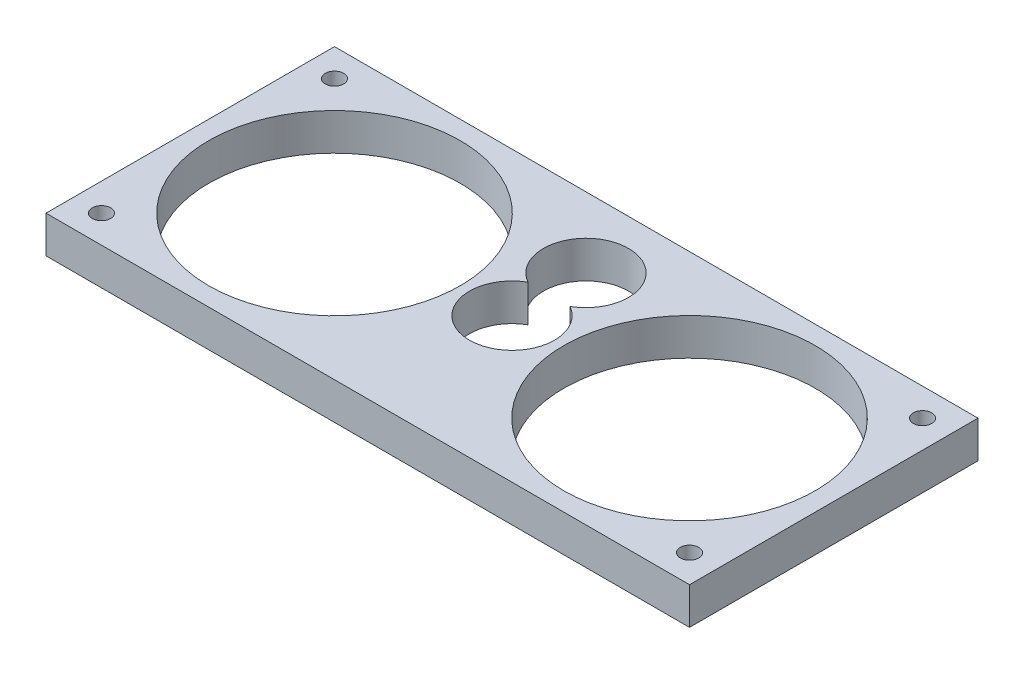
ISO-10303-21;
HEADER;
FILE_DESCRIPTION(('STEP AP214'),'2;1');
FILE_NAME('part.step','',(''),(''),'','','');
FILE_SCHEMA(('AUTOMOTIVE_DESIGN { 1 0 10303 214 1 1 1 1 }'));
ENDSEC;
DATA;
#1=APPLICATION_CONTEXT('core data for automotive mechanical design processes');
#2=APPLICATION_PROTOCOL_DEFINITION('international standard','automotive_design',2000,#1);
#3=PRODUCT_CONTEXT('',#1,'mechanical');
#4=PRODUCT('Part','Part','',(#3));
#5=PRODUCT_RELATED_PRODUCT_CATEGORY('part','',(#4));
#6=PRODUCT_DEFINITION_FORMATION('','',#4);
#7=PRODUCT_DEFINITION_CONTEXT('part definition',#1,'design');
#8=PRODUCT_DEFINITION('design','',#6,#7);
#9=PRODUCT_DEFINITION_SHAPE('','',#8);
#10=(LENGTH_UNIT() NAMED_UNIT(*) SI_UNIT(.MILLI.,.METRE.));
#11=(NAMED_UNIT(*) PLANE_ANGLE_UNIT() SI_UNIT($,.RADIAN.));
#12=(NAMED_UNIT(*) SI_UNIT($,.STERADIAN.) SOLID_ANGLE_UNIT());
#13=UNCERTAINTY_MEASURE_WITH_UNIT(LENGTH_MEASURE(1.E-05),#10,'distance_accuracy_value','');
#14=(GEOMETRIC_REPRESENTATION_CONTEXT(3) GLOBAL_UNCERTAINTY_ASSIGNED_CONTEXT((#13)) GLOBAL_UNIT_ASSIGNED_CONTEXT((#10,
#11,#12)) REPRESENTATION_CONTEXT('',''));
#15=CARTESIAN_POINT('',(0.,0.,0.));
#16=DIRECTION('',(0.,0.,1.));
#17=DIRECTION('',(1.,0.,0.));
#18=AXIS2_PLACEMENT_3D('',#15,#16,#17);
#19=CARTESIAN_POINT('',(0.,10.,0.));
#20=DIRECTION('',(0.,-1.,0.));
#21=DIRECTION('',(0.,0.,-1.));
#22=AXIS2_PLACEMENT_3D('',#19,#20,#21);
#23=PLANE('',#22);
#24=CARTESIAN_POINT('',(79.5,10.,-31.5));
#25=DIRECTION('',(0.,1.,0.));
#26=DIRECTION('',(0.,0.,1.));
#27=AXIS2_PLACEMENT_3D('',#24,#25,#26);
#28=CIRCLE('',#27,2.5);
#29=CARTESIAN_POINT('',(79.5,10.,-29.));
#30=VERTEX_POINT('',#29);
#31=EDGE_CURVE('E102',#30,#30,#28,.T.);
#32=ORIENTED_EDGE('',*,*,#31,.F.);
#33=EDGE_LOOP('',(#32));
#34=FACE_BOUND('',#33,.T.);
#35=CARTESIAN_POINT('',(79.5,10.,31.5));
#36=DIRECTION('',(0.,1.,0.));
#37=DIRECTION('',(0.,0.,1.));
#38=AXIS2_PLACEMENT_3D('',#35,#36,#37);
#39=CIRCLE('',#38,2.5);
#40=CARTESIAN_POINT('',(79.5,10.,34.));
#41=VERTEX_POINT('',#40);
#42=EDGE_CURVE('E108',#41,#41,#39,.T.);
#43=ORIENTED_EDGE('',*,*,#42,.F.);
#44=EDGE_LOOP('',(#43));
#45=FACE_BOUND('',#44,.T.);
#46=CARTESIAN_POINT('',(-79.5,10.,31.5));
#47=DIRECTION('',(0.,1.,0.));
#48=DIRECTION('',(0.,0.,1.));
#49=AXIS2_PLACEMENT_3D('',#46,#47,#48);
#50=CIRCLE('',#49,2.5);
#51=CARTESIAN_POINT('',(-79.5,10.,34.));
#52=VERTEX_POINT('',#51);
#53=EDGE_CURVE('E114',#52,#52,#50,.T.);
#54=ORIENTED_EDGE('',*,*,#53,.F.);
#55=EDGE_LOOP('',(#54));
#56=FACE_BOUND('',#55,.T.);
#57=CARTESIAN_POINT('',(-79.5,10.,-31.5));
#58=DIRECTION('',(0.,1.,0.));
#59=DIRECTION('',(0.,0.,1.));
#60=AXIS2_PLACEMENT_3D('',#57,#58,#59);
#61=CIRCLE('',#60,2.5);
#62=CARTESIAN_POINT('',(-79.5,10.,-29.));
#63=VERTEX_POINT('',#62);
#64=EDGE_CURVE('E120',#63,#63,#61,.T.);
#65=ORIENTED_EDGE('',*,*,#64,.F.);
#66=EDGE_LOOP('',(#65));
#67=FACE_BOUND('',#66,.T.);
#68=CARTESIAN_POINT('',(48.,10.,0.));
#69=DIRECTION('',(0.,1.,0.));
#70=DIRECTION('',(0.,0.,1.));
#71=AXIS2_PLACEMENT_3D('',#68,#69,#70);
#72=CIRCLE('',#71,34.);
#73=CARTESIAN_POINT('',(48.,10.,34.));
#74=VERTEX_POINT('',#73);
#75=EDGE_CURVE('E126',#74,#74,#72,.T.);
#76=ORIENTED_EDGE('',*,*,#75,.F.);
#77=EDGE_LOOP('',(#76));
#78=FACE_BOUND('',#77,.T.);
#79=CARTESIAN_POINT('',(-48.,10.,0.));
#80=DIRECTION('',(0.,1.,0.));
#81=DIRECTION('',(0.,0.,1.));
#82=AXIS2_PLACEMENT_3D('',#79,#80,#81);
#83=CIRCLE('',#82,34.);
#84=CARTESIAN_POINT('',(-48.,10.,34.));
#85=VERTEX_POINT('',#84);
#86=EDGE_CURVE('E132',#85,#85,#83,.T.);
#87=ORIENTED_EDGE('',*,*,#86,.F.);
#88=EDGE_LOOP('',(#87));
#89=FACE_BOUND('',#88,.T.);
#90=DIRECTION('',(0.,0.,1.));
#91=VECTOR('',#90,1.);
#92=CARTESIAN_POINT('',(-87.,10.,39.));
#93=LINE('',#92,#91);
#94=CARTESIAN_POINT('',(-87.,10.,-39.));
#95=VERTEX_POINT('',#94);
#96=CARTESIAN_POINT('',(-87.,10.,39.));
#97=VERTEX_POINT('',#96);
#98=EDGE_CURVE('E138',#95,#97,#93,.T.);
#99=ORIENTED_EDGE('',*,*,#98,.T.);
#100=DIRECTION('',(1.,0.,0.));
#101=VECTOR('',#100,1.);
#102=CARTESIAN_POINT('',(-87.,10.,39.));
#103=LINE('',#102,#101);
#104=CARTESIAN_POINT('',(87.,10.,39.));
#105=VERTEX_POINT('',#104);
#106=EDGE_CURVE('E141',#97,#105,#103,.T.);
#107=ORIENTED_EDGE('',*,*,#106,.T.);
#108=DIRECTION('',(0.,0.,-1.));
#109=VECTOR('',#108,1.);
#110=CARTESIAN_POINT('',(87.,10.,39.));
#111=LINE('',#110,#109);
#112=CARTESIAN_POINT('',(87.,10.,-39.));
#113=VERTEX_POINT('',#112);
#114=EDGE_CURVE('E144',#105,#113,#111,.T.);
#115=ORIENTED_EDGE('',*,*,#114,.T.);
#116=DIRECTION('',(-1.,0.,0.));
#117=VECTOR('',#116,1.);
#118=CARTESIAN_POINT('',(-87.,10.,-39.));
#119=LINE('',#118,#117);
#120=EDGE_CURVE('E146',#113,#95,#119,.T.);
#121=ORIENTED_EDGE('',*,*,#120,.T.);
#122=EDGE_LOOP('',(#99,#107,#115,#121));
#123=FACE_BOUND('',#122,.T.);
#124=CARTESIAN_POINT('',(0.,10.,-20.));
#125=DIRECTION('',(0.,1.,0.));
#126=DIRECTION('',(0.,0.,1.));
#127=AXIS2_PLACEMENT_3D('',#124,#125,#126);
#128=CIRCLE('',#127,11.5);
#129=CARTESIAN_POINT('',(5.67890834580027,10.,-10.));
#130=VERTEX_POINT('',#129);
#131=CARTESIAN_POINT('',(-5.67890834580027,10.,-10.));
#132=VERTEX_POINT('',#131);
#133=EDGE_CURVE('E91',#130,#132,#128,.T.);
#134=ORIENTED_EDGE('',*,*,#133,.F.);
#135=CARTESIAN_POINT('',(0.,10.,0.));
#136=DIRECTION('',(0.,1.,0.));
#137=DIRECTION('',(0.,0.,1.));
#138=AXIS2_PLACEMENT_3D('',#135,#136,#137);
#139=CIRCLE('',#138,11.5);
#140=EDGE_CURVE('E85',#132,#130,#139,.T.);
#141=ORIENTED_EDGE('',*,*,#140,.F.);
#142=EDGE_LOOP('',(#134,#141));
#143=FACE_BOUND('',#142,.T.);
#144=ADVANCED_FACE('F33',(#34,#45,#56,#67,#78,#89,#123,#143),#23,.F.);
#145=CARTESIAN_POINT('',(0.,0.,0.));
#146=DIRECTION('',(0.,-1.,0.));
#147=DIRECTION('',(0.,0.,-1.));
#148=AXIS2_PLACEMENT_3D('',#145,#146,#147);
#149=PLANE('',#148);
#150=CARTESIAN_POINT('',(79.5,0.,31.5));
#151=DIRECTION('',(0.,1.,0.));
#152=DIRECTION('',(0.,0.,1.));
#153=AXIS2_PLACEMENT_3D('',#150,#151,#152);
#154=CIRCLE('',#153,2.5);
#155=CARTESIAN_POINT('',(79.5,0.,34.));
#156=VERTEX_POINT('',#155);
#157=EDGE_CURVE('E105',#156,#156,#154,.T.);
#158=ORIENTED_EDGE('',*,*,#157,.T.);
#159=EDGE_LOOP('',(#158));
#160=FACE_BOUND('',#159,.T.);
#161=CARTESIAN_POINT('',(-79.5,0.,-31.5));
#162=DIRECTION('',(0.,1.,0.));
#163=DIRECTION('',(0.,0.,1.));
#164=AXIS2_PLACEMENT_3D('',#161,#162,#163);
#165=CIRCLE('',#164,2.5);
#166=CARTESIAN_POINT('',(-79.5,0.,-29.));
#167=VERTEX_POINT('',#166);
#168=EDGE_CURVE('E117',#167,#167,#165,.T.);
#169=ORIENTED_EDGE('',*,*,#168,.T.);
#170=EDGE_LOOP('',(#169));
#171=FACE_BOUND('',#170,.T.);
#172=CARTESIAN_POINT('',(-48.,0.,0.));
#173=DIRECTION('',(0.,1.,0.));
#174=DIRECTION('',(0.,0.,1.));
#175=AXIS2_PLACEMENT_3D('',#172,#173,#174);
#176=CIRCLE('',#175,34.);
#177=CARTESIAN_POINT('',(-48.,0.,34.));
#178=VERTEX_POINT('',#177);
#179=EDGE_CURVE('E129',#178,#178,#176,.T.);
#180=ORIENTED_EDGE('',*,*,#179,.T.);
#181=EDGE_LOOP('',(#180));
#182=FACE_BOUND('',#181,.T.);
#183=DIRECTION('',(0.,0.,1.));
#184=VECTOR('',#183,1.);
#185=CARTESIAN_POINT('',(-87.,0.,39.));
#186=LINE('',#185,#184);
#187=CARTESIAN_POINT('',(-87.,0.,-39.));
#188=VERTEX_POINT('',#187);
#189=CARTESIAN_POINT('',(-87.,0.,39.));
#190=VERTEX_POINT('',#189);
#191=EDGE_CURVE('E135',#188,#190,#186,.T.);
#192=ORIENTED_EDGE('',*,*,#191,.F.);
#193=DIRECTION('',(-1.,0.,0.));
#194=VECTOR('',#193,1.);
#195=CARTESIAN_POINT('',(-87.,0.,-39.));
#196=LINE('',#195,#194);
#197=CARTESIAN_POINT('',(87.,0.,-39.));
#198=VERTEX_POINT('',#197);
#199=EDGE_CURVE('E142',#198,#188,#196,.T.);
#200=ORIENTED_EDGE('',*,*,#199,.F.);
#201=DIRECTION('',(0.,0.,-1.));
#202=VECTOR('',#201,1.);
#203=CARTESIAN_POINT('',(87.,0.,39.));
#204=LINE('',#203,#202);
#205=CARTESIAN_POINT('',(87.,0.,39.));
#206=VERTEX_POINT('',#205);
#207=EDGE_CURVE('E153',#206,#198,#204,.T.);
#208=ORIENTED_EDGE('',*,*,#207,.F.);
#209=DIRECTION('',(1.,0.,0.));
#210=VECTOR('',#209,1.);
#211=CARTESIAN_POINT('',(-87.,0.,39.));
#212=LINE('',#211,#210);
#213=EDGE_CURVE('E151',#190,#206,#212,.T.);
#214=ORIENTED_EDGE('',*,*,#213,.F.);
#215=EDGE_LOOP('',(#192,#200,#208,#214));
#216=FACE_BOUND('',#215,.T.);
#217=CARTESIAN_POINT('',(48.,0.,0.));
#218=DIRECTION('',(0.,1.,0.));
#219=DIRECTION('',(0.,0.,1.));
#220=AXIS2_PLACEMENT_3D('',#217,#218,#219);
#221=CIRCLE('',#220,34.);
#222=CARTESIAN_POINT('',(48.,0.,34.));
#223=VERTEX_POINT('',#222);
#224=EDGE_CURVE('E123',#223,#223,#221,.T.);
#225=ORIENTED_EDGE('',*,*,#224,.T.);
#226=EDGE_LOOP('',(#225));
#227=FACE_BOUND('',#226,.T.);
#228=CARTESIAN_POINT('',(-79.5,0.,31.5));
#229=DIRECTION('',(0.,1.,0.));
#230=DIRECTION('',(0.,0.,1.));
#231=AXIS2_PLACEMENT_3D('',#228,#229,#230);
#232=CIRCLE('',#231,2.5);
#233=CARTESIAN_POINT('',(-79.5,0.,34.));
#234=VERTEX_POINT('',#233);
#235=EDGE_CURVE('E111',#234,#234,#232,.T.);
#236=ORIENTED_EDGE('',*,*,#235,.T.);
#237=EDGE_LOOP('',(#236));
#238=FACE_BOUND('',#237,.T.);
#239=CARTESIAN_POINT('',(79.5,0.,-31.5));
#240=DIRECTION('',(0.,1.,0.));
#241=DIRECTION('',(0.,0.,1.));
#242=AXIS2_PLACEMENT_3D('',#239,#240,#241);
#243=CIRCLE('',#242,2.5);
#244=CARTESIAN_POINT('',(79.5,0.,-29.));
#245=VERTEX_POINT('',#244);
#246=EDGE_CURVE('E101',#245,#245,#243,.T.);
#247=ORIENTED_EDGE('',*,*,#246,.T.);
#248=EDGE_LOOP('',(#247));
#249=FACE_BOUND('',#248,.T.);
#250=CARTESIAN_POINT('',(0.,0.,0.));
#251=DIRECTION('',(0.,1.,0.));
#252=DIRECTION('',(0.,0.,1.));
#253=AXIS2_PLACEMENT_3D('',#250,#251,#252);
#254=CIRCLE('',#253,11.5);
#255=CARTESIAN_POINT('',(-5.67890834580027,0.,-10.));
#256=VERTEX_POINT('',#255);
#257=CARTESIAN_POINT('',(5.67890834580027,0.,-10.));
#258=VERTEX_POINT('',#257);
#259=EDGE_CURVE('E95',#256,#258,#254,.T.);
#260=ORIENTED_EDGE('',*,*,#259,.T.);
#261=CARTESIAN_POINT('',(0.,0.,-20.));
#262=DIRECTION('',(0.,1.,0.));
#263=DIRECTION('',(0.,0.,1.));
#264=AXIS2_PLACEMENT_3D('',#261,#262,#263);
#265=CIRCLE('',#264,11.5);
#266=EDGE_CURVE('E55',#258,#256,#265,.T.);
#267=ORIENTED_EDGE('',*,*,#266,.T.);
#268=EDGE_LOOP('',(#260,#267));
#269=FACE_BOUND('',#268,.T.);
#270=ADVANCED_FACE('F171',(#160,#171,#182,#216,#227,#238,#249,#269),#149,.T.);
#271=CARTESIAN_POINT('',(-87.,10.,39.));
#272=DIRECTION('',(1.,0.,0.));
#273=DIRECTION('',(0.,0.,-1.));
#274=AXIS2_PLACEMENT_3D('',#271,#272,#273);
#275=PLANE('',#274);
#276=ORIENTED_EDGE('',*,*,#191,.T.);
#277=DIRECTION('',(0.,-1.,0.));
#278=VECTOR('',#277,1.);
#279=CARTESIAN_POINT('',(-87.,10.,39.));
#280=LINE('',#279,#278);
#281=EDGE_CURVE('E11',#97,#190,#280,.T.);
#282=ORIENTED_EDGE('',*,*,#281,.F.);
#283=ORIENTED_EDGE('',*,*,#98,.F.);
#284=DIRECTION('',(0.,-1.,0.));
#285=VECTOR('',#284,1.);
#286=CARTESIAN_POINT('',(-87.,10.,-39.));
#287=LINE('',#286,#285);
#288=EDGE_CURVE('E148',#95,#188,#287,.T.);
#289=ORIENTED_EDGE('',*,*,#288,.T.);
#290=EDGE_LOOP('',(#276,#282,#283,#289));
#291=FACE_BOUND('',#290,.T.);
#292=ADVANCED_FACE('F35',(#291),#275,.F.);
#293=CARTESIAN_POINT('',(-87.,10.,39.));
#294=DIRECTION('',(0.,0.,-1.));
#295=DIRECTION('',(-1.,0.,0.));
#296=AXIS2_PLACEMENT_3D('',#293,#294,#295);
#297=PLANE('',#296);
#298=ORIENTED_EDGE('',*,*,#213,.T.);
#299=DIRECTION('',(0.,-1.,0.));
#300=VECTOR('',#299,1.);
#301=CARTESIAN_POINT('',(87.,10.,39.));
#302=LINE('',#301,#300);
#303=EDGE_CURVE('E41',#105,#206,#302,.T.);
#304=ORIENTED_EDGE('',*,*,#303,.F.);
#305=ORIENTED_EDGE('',*,*,#106,.F.);
#306=ORIENTED_EDGE('',*,*,#281,.T.);
#307=EDGE_LOOP('',(#298,#304,#305,#306));
#308=FACE_BOUND('',#307,.T.);
#309=ADVANCED_FACE('F181',(#308),#297,.F.);
#310=CARTESIAN_POINT('',(87.,10.,39.));
#311=DIRECTION('',(-1.,0.,0.));
#312=DIRECTION('',(0.,0.,1.));
#313=AXIS2_PLACEMENT_3D('',#310,#311,#312);
#314=PLANE('',#313);
#315=ORIENTED_EDGE('',*,*,#207,.T.);
#316=DIRECTION('',(0.,-1.,0.));
#317=VECTOR('',#316,1.);
#318=CARTESIAN_POINT('',(87.,10.,-39.));
#319=LINE('',#318,#317);
#320=EDGE_CURVE('E158',#113,#198,#319,.T.);
#321=ORIENTED_EDGE('',*,*,#320,.F.);
#322=ORIENTED_EDGE('',*,*,#114,.F.);
#323=ORIENTED_EDGE('',*,*,#303,.T.);
#324=EDGE_LOOP('',(#315,#321,#322,#323));
#325=FACE_BOUND('',#324,.T.);
#326=ADVANCED_FACE('F165',(#325),#314,.F.);
#327=CARTESIAN_POINT('',(-87.,10.,-39.));
#328=DIRECTION('',(0.,0.,1.));
#329=DIRECTION('',(1.,0.,0.));
#330=AXIS2_PLACEMENT_3D('',#327,#328,#329);
#331=PLANE('',#330);
#332=ORIENTED_EDGE('',*,*,#199,.T.);
#333=ORIENTED_EDGE('',*,*,#288,.F.);
#334=ORIENTED_EDGE('',*,*,#120,.F.);
#335=ORIENTED_EDGE('',*,*,#320,.T.);
#336=EDGE_LOOP('',(#332,#333,#334,#335));
#337=FACE_BOUND('',#336,.T.);
#338=ADVANCED_FACE('F175',(#337),#331,.F.);
#339=CARTESIAN_POINT('',(-48.,10.,0.));
#340=DIRECTION('',(0.,-1.,0.));
#341=DIRECTION('',(0.,0.,-1.));
#342=AXIS2_PLACEMENT_3D('',#339,#340,#341);
#343=CYLINDRICAL_SURFACE('',#342,34.);
#344=ORIENTED_EDGE('',*,*,#86,.T.);
#345=EDGE_LOOP('',(#344));
#346=FACE_BOUND('',#345,.T.);
#347=ORIENTED_EDGE('',*,*,#179,.F.);
#348=EDGE_LOOP('',(#347));
#349=FACE_BOUND('',#348,.T.);
#350=ADVANCED_FACE('F199',(#346,#349),#343,.F.);
#351=CARTESIAN_POINT('',(48.,10.,0.));
#352=DIRECTION('',(0.,-1.,0.));
#353=DIRECTION('',(0.,0.,-1.));
#354=AXIS2_PLACEMENT_3D('',#351,#352,#353);
#355=CYLINDRICAL_SURFACE('',#354,34.);
#356=ORIENTED_EDGE('',*,*,#75,.T.);
#357=EDGE_LOOP('',(#356));
#358=FACE_BOUND('',#357,.T.);
#359=ORIENTED_EDGE('',*,*,#224,.F.);
#360=EDGE_LOOP('',(#359));
#361=FACE_BOUND('',#360,.T.);
#362=ADVANCED_FACE('F206',(#358,#361),#355,.F.);
#363=CARTESIAN_POINT('',(-79.5,10.,-31.5));
#364=DIRECTION('',(0.,-1.,0.));
#365=DIRECTION('',(0.,0.,-1.));
#366=AXIS2_PLACEMENT_3D('',#363,#364,#365);
#367=CYLINDRICAL_SURFACE('',#366,2.5);
#368=ORIENTED_EDGE('',*,*,#64,.T.);
#369=EDGE_LOOP('',(#368));
#370=FACE_BOUND('',#369,.T.);
#371=ORIENTED_EDGE('',*,*,#168,.F.);
#372=EDGE_LOOP('',(#371));
#373=FACE_BOUND('',#372,.T.);
#374=ADVANCED_FACE('F211',(#370,#373),#367,.F.);
#375=CARTESIAN_POINT('',(-79.5,10.,31.5));
#376=DIRECTION('',(0.,-1.,0.));
#377=DIRECTION('',(0.,0.,-1.));
#378=AXIS2_PLACEMENT_3D('',#375,#376,#377);
#379=CYLINDRICAL_SURFACE('',#378,2.5);
#380=ORIENTED_EDGE('',*,*,#53,.T.);
#381=EDGE_LOOP('',(#380));
#382=FACE_BOUND('',#381,.T.);
#383=ORIENTED_EDGE('',*,*,#235,.F.);
#384=EDGE_LOOP('',(#383));
#385=FACE_BOUND('',#384,.T.);
#386=ADVANCED_FACE('F221',(#382,#385),#379,.F.);
#387=CARTESIAN_POINT('',(79.5,10.,31.5));
#388=DIRECTION('',(0.,-1.,0.));
#389=DIRECTION('',(0.,0.,-1.));
#390=AXIS2_PLACEMENT_3D('',#387,#388,#389);
#391=CYLINDRICAL_SURFACE('',#390,2.5);
#392=ORIENTED_EDGE('',*,*,#42,.T.);
#393=EDGE_LOOP('',(#392));
#394=FACE_BOUND('',#393,.T.);
#395=ORIENTED_EDGE('',*,*,#157,.F.);
#396=EDGE_LOOP('',(#395));
#397=FACE_BOUND('',#396,.T.);
#398=ADVANCED_FACE('F228',(#394,#397),#391,.F.);
#399=CARTESIAN_POINT('',(79.5,10.,-31.5));
#400=DIRECTION('',(0.,-1.,0.));
#401=DIRECTION('',(0.,0.,-1.));
#402=AXIS2_PLACEMENT_3D('',#399,#400,#401);
#403=CYLINDRICAL_SURFACE('',#402,2.5);
#404=ORIENTED_EDGE('',*,*,#31,.T.);
#405=EDGE_LOOP('',(#404));
#406=FACE_BOUND('',#405,.T.);
#407=ORIENTED_EDGE('',*,*,#246,.F.);
#408=EDGE_LOOP('',(#407));
#409=FACE_BOUND('',#408,.T.);
#410=ADVANCED_FACE('F232',(#406,#409),#403,.F.);
#411=CARTESIAN_POINT('',(0.,10.,-20.));
#412=DIRECTION('',(0.,-1.,0.));
#413=DIRECTION('',(0.,0.,-1.));
#414=AXIS2_PLACEMENT_3D('',#411,#412,#413);
#415=CYLINDRICAL_SURFACE('',#414,11.5);
#416=ORIENTED_EDGE('',*,*,#266,.F.);
#417=DIRECTION('',(0.,-1.,0.));
#418=VECTOR('',#417,1.);
#419=CARTESIAN_POINT('',(5.67890834580027,10.,-10.));
#420=LINE('',#419,#418);
#421=EDGE_CURVE('E87',#130,#258,#420,.T.);
#422=ORIENTED_EDGE('',*,*,#421,.F.);
#423=ORIENTED_EDGE('',*,*,#133,.T.);
#424=DIRECTION('',(0.,-1.,0.));
#425=VECTOR('',#424,1.);
#426=CARTESIAN_POINT('',(-5.67890834580027,10.,-10.));
#427=LINE('',#426,#425);
#428=EDGE_CURVE('E48',#132,#256,#427,.T.);
#429=ORIENTED_EDGE('',*,*,#428,.T.);
#430=EDGE_LOOP('',(#416,#422,#423,#429));
#431=FACE_BOUND('',#430,.T.);
#432=ADVANCED_FACE('F93',(#431),#415,.F.);
#433=CARTESIAN_POINT('',(0.,10.,0.));
#434=DIRECTION('',(0.,-1.,0.));
#435=DIRECTION('',(0.,0.,-1.));
#436=AXIS2_PLACEMENT_3D('',#433,#434,#435);
#437=CYLINDRICAL_SURFACE('',#436,11.5);
#438=ORIENTED_EDGE('',*,*,#259,.F.);
#439=ORIENTED_EDGE('',*,*,#428,.F.);
#440=ORIENTED_EDGE('',*,*,#140,.T.);
#441=ORIENTED_EDGE('',*,*,#421,.T.);
#442=EDGE_LOOP('',(#438,#439,#440,#441));
#443=FACE_BOUND('',#442,.T.);
#444=ADVANCED_FACE('F86',(#443),#437,.F.);
#445=CLOSED_SHELL('',(#144,#270,#292,#309,#326,#338,#350,#362,#374,#386,#398,#410,#432,#444));
#446=MANIFOLD_SOLID_BREP('B2',#445);
#447=ADVANCED_BREP_SHAPE_REPRESENTATION('',(#18,#446),#14);
#448=SHAPE_DEFINITION_REPRESENTATION(#9,#447);
ENDSEC;
END-ISO-10303-21;
